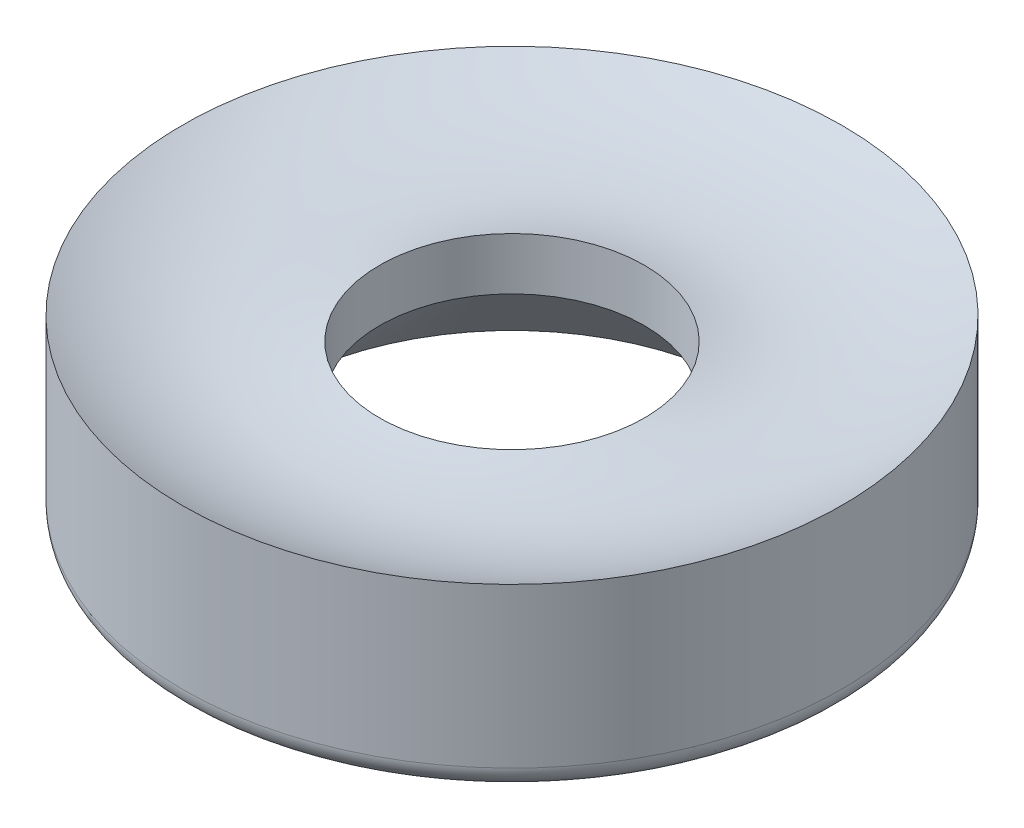
ISO-10303-21;
HEADER;
FILE_DESCRIPTION(('STEP AP214'),'2;1');
FILE_NAME('part.step','',(''),(''),'','','');
FILE_SCHEMA(('AUTOMOTIVE_DESIGN { 1 0 10303 214 1 1 1 1 }'));
ENDSEC;
DATA;
#1=APPLICATION_CONTEXT('core data for automotive mechanical design processes');
#2=APPLICATION_PROTOCOL_DEFINITION('international standard','automotive_design',2000,#1);
#3=PRODUCT_CONTEXT('',#1,'mechanical');
#4=PRODUCT('Part','Part','',(#3));
#5=PRODUCT_RELATED_PRODUCT_CATEGORY('part','',(#4));
#6=PRODUCT_DEFINITION_FORMATION('','',#4);
#7=PRODUCT_DEFINITION_CONTEXT('part definition',#1,'design');
#8=PRODUCT_DEFINITION('design','',#6,#7);
#9=PRODUCT_DEFINITION_SHAPE('','',#8);
#10=(LENGTH_UNIT() NAMED_UNIT(*) SI_UNIT(.MILLI.,.METRE.));
#11=(NAMED_UNIT(*) PLANE_ANGLE_UNIT() SI_UNIT($,.RADIAN.));
#12=(NAMED_UNIT(*) SI_UNIT($,.STERADIAN.) SOLID_ANGLE_UNIT());
#13=UNCERTAINTY_MEASURE_WITH_UNIT(LENGTH_MEASURE(1.E-05),#10,'distance_accuracy_value','');
#14=(GEOMETRIC_REPRESENTATION_CONTEXT(3) GLOBAL_UNCERTAINTY_ASSIGNED_CONTEXT((#13)) GLOBAL_UNIT_ASSIGNED_CONTEXT((#10,
#11,#12)) REPRESENTATION_CONTEXT('',''));
#15=CARTESIAN_POINT('',(0.,0.,0.));
#16=DIRECTION('',(0.,0.,1.));
#17=DIRECTION('',(1.,0.,0.));
#18=AXIS2_PLACEMENT_3D('',#15,#16,#17);
#19=CARTESIAN_POINT('',(0.,6.35,30.431156816));
#20=DIRECTION('',(0.,-1.,0.));
#21=DIRECTION('',(0.,0.,-1.));
#22=AXIS2_PLACEMENT_3D('',#19,#20,#21);
#23=CYLINDRICAL_SURFACE('',#22,3.175);
#24=DIRECTION('',(0.,1.,0.));
#25=VECTOR('',#24,1.);
#26=CARTESIAN_POINT('',(1.27,3.81,33.341092382297));
#27=LINE('',#26,#25);
#28=CARTESIAN_POINT('',(1.27,3.81,33.341092382297));
#29=VERTEX_POINT('',#28);
#30=CARTESIAN_POINT('',(1.27,6.35,33.341092382297));
#31=VERTEX_POINT('',#30);
#32=EDGE_CURVE('E770',#29,#31,#27,.T.);
#33=ORIENTED_EDGE('',*,*,#32,.T.);
#34=CARTESIAN_POINT('',(0.,6.35,30.431156816));
#35=DIRECTION('',(0.,-1.,0.));
#36=DIRECTION('',(0.,0.,-1.));
#37=AXIS2_PLACEMENT_3D('',#34,#35,#36);
#38=CIRCLE('',#37,3.175);
#39=CARTESIAN_POINT('',(-2.90993556629696,6.35,29.161156816));
#40=VERTEX_POINT('',#39);
#41=EDGE_CURVE('E343',#40,#31,#38,.T.);
#42=ORIENTED_EDGE('',*,*,#41,.F.);
#43=DIRECTION('',(0.,-1.,0.));
#44=VECTOR('',#43,1.);
#45=CARTESIAN_POINT('',(-2.90993556629696,9.31783133207061,29.161156816));
#46=LINE('',#45,#44);
#47=CARTESIAN_POINT('',(-2.90993556629696,0.,29.161156816));
#48=VERTEX_POINT('',#47);
#49=EDGE_CURVE('E231',#40,#48,#46,.T.);
#50=ORIENTED_EDGE('',*,*,#49,.T.);
#51=CARTESIAN_POINT('',(0.,0.,30.431156816));
#52=DIRECTION('',(0.,-1.,0.));
#53=DIRECTION('',(0.,0.,-1.));
#54=AXIS2_PLACEMENT_3D('',#51,#52,#53);
#55=CIRCLE('',#54,3.175);
#56=CARTESIAN_POINT('',(-2.90993556629696,0.,31.701156816));
#57=VERTEX_POINT('',#56);
#58=EDGE_CURVE('E328',#48,#57,#55,.T.);
#59=ORIENTED_EDGE('',*,*,#58,.T.);
#60=DIRECTION('',(0.,-1.,0.));
#61=VECTOR('',#60,1.);
#62=CARTESIAN_POINT('',(-2.90993556629696,9.31783133207061,31.701156816));
#63=LINE('',#62,#61);
#64=CARTESIAN_POINT('',(-2.90993556629696,3.81,31.701156816));
#65=VERTEX_POINT('',#64);
#66=EDGE_CURVE('E228',#65,#57,#63,.T.);
#67=ORIENTED_EDGE('',*,*,#66,.F.);
#68=CARTESIAN_POINT('',(0.,3.81,30.431156816));
#69=DIRECTION('',(0.,1.,0.));
#70=DIRECTION('',(0.,0.,1.));
#71=AXIS2_PLACEMENT_3D('',#68,#69,#70);
#72=CIRCLE('',#71,3.175);
#73=EDGE_CURVE('E208',#65,#29,#72,.T.);
#74=ORIENTED_EDGE('',*,*,#73,.T.);
#75=EDGE_LOOP('',(#33,#42,#50,#59,#67,#74));
#76=FACE_BOUND('',#75,.T.);
#77=ADVANCED_FACE('F35',(#76),#23,.F.);
#78=CARTESIAN_POINT('',(-30.431156816,6.35,0.));
#79=DIRECTION('',(0.,-1.,0.));
#80=DIRECTION('',(0.,0.,-1.));
#81=AXIS2_PLACEMENT_3D('',#78,#79,#80);
#82=CYLINDRICAL_SURFACE('',#81,3.175);
#83=DIRECTION('',(0.,1.,0.));
#84=VECTOR('',#83,1.);
#85=CARTESIAN_POINT('',(-33.341092382297,3.81,1.26999999999965));
#86=LINE('',#85,#84);
#87=CARTESIAN_POINT('',(-33.341092382297,3.81,1.26999999999965));
#88=VERTEX_POINT('',#87);
#89=CARTESIAN_POINT('',(-33.341092382297,6.35,1.26999999999965));
#90=VERTEX_POINT('',#89);
#91=EDGE_CURVE('E771',#88,#90,#86,.T.);
#92=ORIENTED_EDGE('',*,*,#91,.T.);
#93=CARTESIAN_POINT('',(-30.431156816,6.35,0.));
#94=DIRECTION('',(0.,-1.,0.));
#95=DIRECTION('',(0.,0.,-1.));
#96=AXIS2_PLACEMENT_3D('',#93,#94,#95);
#97=CIRCLE('',#96,3.175);
#98=CARTESIAN_POINT('',(-29.161156816,6.35,-2.90993556629695));
#99=VERTEX_POINT('',#98);
#100=EDGE_CURVE('E326',#99,#90,#97,.T.);
#101=ORIENTED_EDGE('',*,*,#100,.F.);
#102=DIRECTION('',(0.,-1.,0.));
#103=VECTOR('',#102,1.);
#104=CARTESIAN_POINT('',(-29.161156816,9.31783133207063,-2.90993556629727));
#105=LINE('',#104,#103);
#106=CARTESIAN_POINT('',(-29.161156816,0.,-2.90993556629727));
#107=VERTEX_POINT('',#106);
#108=EDGE_CURVE('E258',#99,#107,#105,.T.);
#109=ORIENTED_EDGE('',*,*,#108,.T.);
#110=CARTESIAN_POINT('',(-30.431156816,0.,0.));
#111=DIRECTION('',(0.,-1.,0.));
#112=DIRECTION('',(0.,0.,-1.));
#113=AXIS2_PLACEMENT_3D('',#110,#111,#112);
#114=CIRCLE('',#113,3.175);
#115=CARTESIAN_POINT('',(-31.701156816,0.,-2.90993556629729));
#116=VERTEX_POINT('',#115);
#117=EDGE_CURVE('E329',#107,#116,#114,.T.);
#118=ORIENTED_EDGE('',*,*,#117,.T.);
#119=DIRECTION('',(0.,-1.,0.));
#120=VECTOR('',#119,1.);
#121=CARTESIAN_POINT('',(-31.701156816,9.31783133207063,-2.90993556629729));
#122=LINE('',#121,#120);
#123=CARTESIAN_POINT('',(-31.701156816,3.81,-2.90993556629729));
#124=VERTEX_POINT('',#123);
#125=EDGE_CURVE('E256',#124,#116,#122,.T.);
#126=ORIENTED_EDGE('',*,*,#125,.F.);
#127=CARTESIAN_POINT('',(-30.431156816,3.81,-3.18749448427419E-13));
#128=DIRECTION('',(0.,1.,0.));
#129=DIRECTION('',(-1.,0.,0.));
#130=AXIS2_PLACEMENT_3D('',#127,#128,#129);
#131=CIRCLE('',#130,3.175);
#132=EDGE_CURVE('E789',#124,#88,#131,.T.);
#133=ORIENTED_EDGE('',*,*,#132,.T.);
#134=EDGE_LOOP('',(#92,#101,#109,#118,#126,#133));
#135=FACE_BOUND('',#134,.T.);
#136=ADVANCED_FACE('F424',(#135),#82,.F.);
#137=CARTESIAN_POINT('',(30.431156816,6.35,0.));
#138=DIRECTION('',(0.,-1.,0.));
#139=DIRECTION('',(0.,0.,-1.));
#140=AXIS2_PLACEMENT_3D('',#137,#138,#139);
#141=CYLINDRICAL_SURFACE('',#140,3.175);
#142=DIRECTION('',(0.,1.,0.));
#143=VECTOR('',#142,1.);
#144=CARTESIAN_POINT('',(33.341092382297,3.81,-1.26999999999988));
#145=LINE('',#144,#143);
#146=CARTESIAN_POINT('',(33.341092382297,3.81,-1.26999999999988));
#147=VERTEX_POINT('',#146);
#148=CARTESIAN_POINT('',(33.341092382297,6.35,-1.26999999999988));
#149=VERTEX_POINT('',#148);
#150=EDGE_CURVE('E249',#147,#149,#145,.T.);
#151=ORIENTED_EDGE('',*,*,#150,.T.);
#152=CARTESIAN_POINT('',(30.431156816,6.35,0.));
#153=DIRECTION('',(0.,-1.,0.));
#154=DIRECTION('',(0.,0.,-1.));
#155=AXIS2_PLACEMENT_3D('',#152,#153,#154);
#156=CIRCLE('',#155,3.175);
#157=CARTESIAN_POINT('',(29.161156816,6.35,2.90993556629696));
#158=VERTEX_POINT('',#157);
#159=EDGE_CURVE('E338',#158,#149,#156,.T.);
#160=ORIENTED_EDGE('',*,*,#159,.F.);
#161=DIRECTION('',(0.,-1.,0.));
#162=VECTOR('',#161,1.);
#163=CARTESIAN_POINT('',(29.161156816,9.31783133207062,2.90993556629706));
#164=LINE('',#163,#162);
#165=CARTESIAN_POINT('',(29.161156816,0.,2.90993556629706));
#166=VERTEX_POINT('',#165);
#167=EDGE_CURVE('E279',#158,#166,#164,.T.);
#168=ORIENTED_EDGE('',*,*,#167,.T.);
#169=CARTESIAN_POINT('',(30.431156816,0.,0.));
#170=DIRECTION('',(0.,-1.,0.));
#171=DIRECTION('',(0.,0.,-1.));
#172=AXIS2_PLACEMENT_3D('',#169,#170,#171);
#173=CIRCLE('',#172,3.175);
#174=CARTESIAN_POINT('',(31.701156816,0.,2.90993556629707));
#175=VERTEX_POINT('',#174);
#176=EDGE_CURVE('E325',#166,#175,#173,.T.);
#177=ORIENTED_EDGE('',*,*,#176,.T.);
#178=DIRECTION('',(0.,-1.,0.));
#179=VECTOR('',#178,1.);
#180=CARTESIAN_POINT('',(31.701156816,9.31783133207062,2.90993556629707));
#181=LINE('',#180,#179);
#182=CARTESIAN_POINT('',(31.701156816,3.81,2.90993556629707));
#183=VERTEX_POINT('',#182);
#184=EDGE_CURVE('E277',#183,#175,#181,.T.);
#185=ORIENTED_EDGE('',*,*,#184,.F.);
#186=CARTESIAN_POINT('',(30.431156816,3.81,1.06249816142473E-13));
#187=DIRECTION('',(0.,1.,0.));
#188=DIRECTION('',(1.,0.,0.));
#189=AXIS2_PLACEMENT_3D('',#186,#187,#188);
#190=CIRCLE('',#189,3.175);
#191=EDGE_CURVE('E806',#183,#147,#190,.T.);
#192=ORIENTED_EDGE('',*,*,#191,.T.);
#193=EDGE_LOOP('',(#151,#160,#168,#177,#185,#192));
#194=FACE_BOUND('',#193,.T.);
#195=ADVANCED_FACE('F430',(#194),#141,.F.);
#196=CARTESIAN_POINT('',(0.,6.35,-30.431156816));
#197=DIRECTION('',(0.,-1.,0.));
#198=DIRECTION('',(0.,0.,-1.));
#199=AXIS2_PLACEMENT_3D('',#196,#197,#198);
#200=CYLINDRICAL_SURFACE('',#199,3.175);
#201=DIRECTION('',(0.,1.,0.));
#202=VECTOR('',#201,1.);
#203=CARTESIAN_POINT('',(-1.27,3.81,-33.341092382297));
#204=LINE('',#203,#202);
#205=CARTESIAN_POINT('',(-1.27,3.81,-33.341092382297));
#206=VERTEX_POINT('',#205);
#207=CARTESIAN_POINT('',(-1.27,6.35,-33.341092382297));
#208=VERTEX_POINT('',#207);
#209=EDGE_CURVE('E301',#206,#208,#204,.T.);
#210=ORIENTED_EDGE('',*,*,#209,.T.);
#211=CARTESIAN_POINT('',(0.,6.35,-30.431156816));
#212=DIRECTION('',(0.,-1.,0.));
#213=DIRECTION('',(0.,0.,-1.));
#214=AXIS2_PLACEMENT_3D('',#211,#212,#213);
#215=CIRCLE('',#214,3.175);
#216=CARTESIAN_POINT('',(2.90993556629696,6.35,-29.161156816));
#217=VERTEX_POINT('',#216);
#218=EDGE_CURVE('E332',#217,#208,#215,.T.);
#219=ORIENTED_EDGE('',*,*,#218,.F.);
#220=DIRECTION('',(0.,-1.,0.));
#221=VECTOR('',#220,1.);
#222=CARTESIAN_POINT('',(2.90993556629696,9.31783133207061,-29.161156816));
#223=LINE('',#222,#221);
#224=CARTESIAN_POINT('',(2.90993556629696,0.,-29.161156816));
#225=VERTEX_POINT('',#224);
#226=EDGE_CURVE('E320',#217,#225,#223,.T.);
#227=ORIENTED_EDGE('',*,*,#226,.T.);
#228=CARTESIAN_POINT('',(0.,0.,-30.431156816));
#229=DIRECTION('',(0.,-1.,0.));
#230=DIRECTION('',(0.,0.,-1.));
#231=AXIS2_PLACEMENT_3D('',#228,#229,#230);
#232=CIRCLE('',#231,3.175);
#233=CARTESIAN_POINT('',(2.90993556629696,0.,-31.701156816));
#234=VERTEX_POINT('',#233);
#235=EDGE_CURVE('E335',#225,#234,#232,.T.);
#236=ORIENTED_EDGE('',*,*,#235,.T.);
#237=DIRECTION('',(0.,-1.,0.));
#238=VECTOR('',#237,1.);
#239=CARTESIAN_POINT('',(2.90993556629696,9.31783133207061,-31.701156816));
#240=LINE('',#239,#238);
#241=CARTESIAN_POINT('',(2.90993556629696,3.81,-31.701156816));
#242=VERTEX_POINT('',#241);
#243=EDGE_CURVE('E318',#242,#234,#240,.T.);
#244=ORIENTED_EDGE('',*,*,#243,.F.);
#245=CARTESIAN_POINT('',(0.,3.81,-30.431156816));
#246=DIRECTION('',(0.,1.,0.));
#247=DIRECTION('',(0.,0.,-1.));
#248=AXIS2_PLACEMENT_3D('',#245,#246,#247);
#249=CIRCLE('',#248,3.175);
#250=EDGE_CURVE('E291',#242,#206,#249,.T.);
#251=ORIENTED_EDGE('',*,*,#250,.T.);
#252=EDGE_LOOP('',(#210,#219,#227,#236,#244,#251));
#253=FACE_BOUND('',#252,.T.);
#254=ADVANCED_FACE('F409',(#253),#200,.F.);
#255=CARTESIAN_POINT('',(0.,88.138,0.));
#256=DIRECTION('',(0.,-1.,0.));
#257=DIRECTION('',(0.,0.,-1.));
#258=AXIS2_PLACEMENT_3D('',#255,#256,#257);
#259=CYLINDRICAL_SURFACE('',#258,14.7955);
#260=CARTESIAN_POINT('',(0.,11.9380000000001,0.));
#261=DIRECTION('',(0.,-1.,0.));
#262=DIRECTION('',(0.,0.,-1.));
#263=AXIS2_PLACEMENT_3D('',#260,#261,#262);
#264=CIRCLE('',#263,14.7955);
#265=CARTESIAN_POINT('',(0.,11.938,-14.7955));
#266=VERTEX_POINT('',#265);
#267=EDGE_CURVE('E353',#266,#266,#264,.T.);
#268=ORIENTED_EDGE('',*,*,#267,.T.);
#269=EDGE_LOOP('',(#268));
#270=FACE_BOUND('',#269,.T.);
#271=CARTESIAN_POINT('',(0.,17.78,0.));
#272=DIRECTION('',(0.,-1.,0.));
#273=DIRECTION('',(0.,0.,-1.));
#274=AXIS2_PLACEMENT_3D('',#271,#272,#273);
#275=CIRCLE('',#274,14.7955);
#276=CARTESIAN_POINT('',(0.,17.78,-14.7955));
#277=VERTEX_POINT('',#276);
#278=EDGE_CURVE('E350',#277,#277,#275,.T.);
#279=ORIENTED_EDGE('',*,*,#278,.F.);
#280=EDGE_LOOP('',(#279));
#281=FACE_BOUND('',#280,.T.);
#282=ADVANCED_FACE('F375',(#270,#281),#259,.F.);
#283=CARTESIAN_POINT('',(0.,20.32,0.));
#284=DIRECTION('',(0.,-1.,0.));
#285=DIRECTION('',(0.,0.,-1.));
#286=AXIS2_PLACEMENT_3D('',#283,#284,#285);
#287=CYLINDRICAL_SURFACE('',#286,36.83);
#288=CARTESIAN_POINT('',(0.,2.54,0.));
#289=DIRECTION('',(0.,1.,0.));
#290=DIRECTION('',(0.,0.,1.));
#291=AXIS2_PLACEMENT_3D('',#288,#289,#290);
#292=CIRCLE('',#291,36.83);
#293=CARTESIAN_POINT('',(0.,2.54,36.83));
#294=VERTEX_POINT('',#293);
#295=EDGE_CURVE('E46',#294,#294,#292,.T.);
#296=ORIENTED_EDGE('',*,*,#295,.T.);
#297=EDGE_LOOP('',(#296));
#298=FACE_BOUND('',#297,.T.);
#299=CARTESIAN_POINT('',(0.,20.32,0.));
#300=DIRECTION('',(0.,-1.,0.));
#301=DIRECTION('',(0.,0.,-1.));
#302=AXIS2_PLACEMENT_3D('',#299,#300,#301);
#303=CIRCLE('',#302,36.83);
#304=CARTESIAN_POINT('',(0.,20.32,-36.83));
#305=VERTEX_POINT('',#304);
#306=EDGE_CURVE('E345',#305,#305,#303,.T.);
#307=ORIENTED_EDGE('',*,*,#306,.T.);
#308=EDGE_LOOP('',(#307));
#309=FACE_BOUND('',#308,.T.);
#310=ADVANCED_FACE('F408',(#298,#309),#287,.T.);
#311=CARTESIAN_POINT('',(0.,0.,0.));
#312=DIRECTION('',(0.,1.,0.));
#313=DIRECTION('',(0.,0.,1.));
#314=AXIS2_PLACEMENT_3D('',#311,#312,#313);
#315=PLANE('',#314);
#316=CARTESIAN_POINT('',(-30.431156816,0.,-3.18749448427419E-13));
#317=DIRECTION('',(0.,-1.,0.));
#318=DIRECTION('',(-1.,0.,0.));
#319=AXIS2_PLACEMENT_3D('',#316,#317,#318);
#320=CIRCLE('',#319,4.445);
#321=CARTESIAN_POINT('',(-31.701156816,0.,-4.25970949713743));
#322=VERTEX_POINT('',#321);
#323=CARTESIAN_POINT('',(-29.161156816,0.,-4.25970949713741));
#324=VERTEX_POINT('',#323);
#325=EDGE_CURVE('E245',#322,#324,#320,.T.);
#326=ORIENTED_EDGE('',*,*,#325,.F.);
#327=DIRECTION('',(0.,0.,-1.));
#328=VECTOR('',#327,1.);
#329=CARTESIAN_POINT('',(-31.701156816,0.,-4.25970949713743));
#330=LINE('',#329,#328);
#331=EDGE_CURVE('E251',#116,#322,#330,.T.);
#332=ORIENTED_EDGE('',*,*,#331,.F.);
#333=ORIENTED_EDGE('',*,*,#117,.F.);
#334=DIRECTION('',(0.,0.,1.));
#335=VECTOR('',#334,1.);
#336=CARTESIAN_POINT('',(-29.161156816,0.,-4.25970949713741));
#337=LINE('',#336,#335);
#338=EDGE_CURVE('E248',#324,#107,#337,.T.);
#339=ORIENTED_EDGE('',*,*,#338,.F.);
#340=EDGE_LOOP('',(#326,#332,#333,#339));
#341=FACE_BOUND('',#340,.T.);
#342=CARTESIAN_POINT('',(0.,0.,-30.431156816));
#343=DIRECTION('',(0.,-1.,0.));
#344=DIRECTION('',(0.,0.,-1.));
#345=AXIS2_PLACEMENT_3D('',#342,#343,#344);
#346=CIRCLE('',#345,4.445);
#347=CARTESIAN_POINT('',(4.2597094971371,0.,-31.701156816));
#348=VERTEX_POINT('',#347);
#349=CARTESIAN_POINT('',(4.2597094971371,0.,-29.161156816));
#350=VERTEX_POINT('',#349);
#351=EDGE_CURVE('E304',#348,#350,#346,.T.);
#352=ORIENTED_EDGE('',*,*,#351,.F.);
#353=DIRECTION('',(1.,0.,0.));
#354=VECTOR('',#353,1.);
#355=CARTESIAN_POINT('',(4.2597094971371,0.,-31.701156816));
#356=LINE('',#355,#354);
#357=EDGE_CURVE('E313',#234,#348,#356,.T.);
#358=ORIENTED_EDGE('',*,*,#357,.F.);
#359=ORIENTED_EDGE('',*,*,#235,.F.);
#360=DIRECTION('',(-1.,0.,0.));
#361=VECTOR('',#360,1.);
#362=CARTESIAN_POINT('',(4.2597094971371,0.,-29.161156816));
#363=LINE('',#362,#361);
#364=EDGE_CURVE('E311',#350,#225,#363,.T.);
#365=ORIENTED_EDGE('',*,*,#364,.F.);
#366=EDGE_LOOP('',(#352,#358,#359,#365));
#367=FACE_BOUND('',#366,.T.);
#368=CARTESIAN_POINT('',(30.431156816,0.,1.06249816142473E-13));
#369=DIRECTION('',(0.,-1.,0.));
#370=DIRECTION('',(1.,0.,0.));
#371=AXIS2_PLACEMENT_3D('',#368,#369,#370);
#372=CIRCLE('',#371,4.445);
#373=CARTESIAN_POINT('',(31.701156816,0.,4.25970949713721));
#374=VERTEX_POINT('',#373);
#375=CARTESIAN_POINT('',(29.161156816,0.,4.2597094971372));
#376=VERTEX_POINT('',#375);
#377=EDGE_CURVE('E241',#374,#376,#372,.T.);
#378=ORIENTED_EDGE('',*,*,#377,.F.);
#379=DIRECTION('',(0.,0.,1.));
#380=VECTOR('',#379,1.);
#381=CARTESIAN_POINT('',(31.701156816,0.,4.25970949713721));
#382=LINE('',#381,#380);
#383=EDGE_CURVE('E272',#175,#374,#382,.T.);
#384=ORIENTED_EDGE('',*,*,#383,.F.);
#385=ORIENTED_EDGE('',*,*,#176,.F.);
#386=DIRECTION('',(0.,0.,-1.));
#387=VECTOR('',#386,1.);
#388=CARTESIAN_POINT('',(29.161156816,0.,4.2597094971372));
#389=LINE('',#388,#387);
#390=EDGE_CURVE('E270',#376,#166,#389,.T.);
#391=ORIENTED_EDGE('',*,*,#390,.F.);
#392=EDGE_LOOP('',(#378,#384,#385,#391));
#393=FACE_BOUND('',#392,.T.);
#394=CARTESIAN_POINT('',(0.,0.,30.431156816));
#395=DIRECTION('',(0.,-1.,0.));
#396=DIRECTION('',(0.,0.,1.));
#397=AXIS2_PLACEMENT_3D('',#394,#395,#396);
#398=CIRCLE('',#397,4.445);
#399=CARTESIAN_POINT('',(-4.2597094971371,0.,31.701156816));
#400=VERTEX_POINT('',#399);
#401=CARTESIAN_POINT('',(-4.2597094971371,0.,29.161156816));
#402=VERTEX_POINT('',#401);
#403=EDGE_CURVE('E263',#400,#402,#398,.T.);
#404=ORIENTED_EDGE('',*,*,#403,.F.);
#405=DIRECTION('',(-1.,0.,0.));
#406=VECTOR('',#405,1.);
#407=CARTESIAN_POINT('',(-4.2597094971371,0.,31.701156816));
#408=LINE('',#407,#406);
#409=EDGE_CURVE('E225',#57,#400,#408,.T.);
#410=ORIENTED_EDGE('',*,*,#409,.F.);
#411=ORIENTED_EDGE('',*,*,#58,.F.);
#412=DIRECTION('',(1.,0.,0.));
#413=VECTOR('',#412,1.);
#414=CARTESIAN_POINT('',(-4.2597094971371,0.,29.161156816));
#415=LINE('',#414,#413);
#416=EDGE_CURVE('E816',#402,#48,#415,.T.);
#417=ORIENTED_EDGE('',*,*,#416,.F.);
#418=EDGE_LOOP('',(#404,#410,#411,#417));
#419=FACE_BOUND('',#418,.T.);
#420=CARTESIAN_POINT('',(0.,0.,0.));
#421=DIRECTION('',(0.,1.,0.));
#422=DIRECTION('',(0.,0.,1.));
#423=AXIS2_PLACEMENT_3D('',#420,#421,#422);
#424=CIRCLE('',#423,26.67);
#425=CARTESIAN_POINT('',(0.,0.,26.67));
#426=VERTEX_POINT('',#425);
#427=EDGE_CURVE('E358',#426,#426,#424,.T.);
#428=ORIENTED_EDGE('',*,*,#427,.T.);
#429=EDGE_LOOP('',(#428));
#430=FACE_BOUND('',#429,.T.);
#431=CARTESIAN_POINT('',(0.,0.,0.));
#432=DIRECTION('',(0.,1.,0.));
#433=DIRECTION('',(0.,0.,1.));
#434=AXIS2_PLACEMENT_3D('',#431,#432,#433);
#435=CIRCLE('',#434,34.29);
#436=CARTESIAN_POINT('',(0.,0.,34.29));
#437=VERTEX_POINT('',#436);
#438=EDGE_CURVE('E12',#437,#437,#435,.F.);
#439=ORIENTED_EDGE('',*,*,#438,.T.);
#440=EDGE_LOOP('',(#439));
#441=FACE_BOUND('',#440,.T.);
#442=ADVANCED_FACE('F378',(#341,#367,#393,#419,#430,#441),#315,.F.);
#443=CARTESIAN_POINT('',(0.,2.54,0.));
#444=DIRECTION('',(0.,1.,0.));
#445=DIRECTION('',(0.,0.,1.));
#446=AXIS2_PLACEMENT_3D('',#443,#444,#445);
#447=TOROIDAL_SURFACE('',#446,34.29,2.54);
#448=ORIENTED_EDGE('',*,*,#438,.F.);
#449=EDGE_LOOP('',(#448));
#450=FACE_BOUND('',#449,.T.);
#451=ORIENTED_EDGE('',*,*,#295,.F.);
#452=EDGE_LOOP('',(#451));
#453=FACE_BOUND('',#452,.T.);
#454=ADVANCED_FACE('F37',(#450,#453),#447,.T.);
#455=CARTESIAN_POINT('',(0.,11.938,0.));
#456=DIRECTION('',(0.,-1.,0.));
#457=DIRECTION('',(0.,0.,-1.));
#458=AXIS2_PLACEMENT_3D('',#455,#456,#457);
#459=CONICAL_SURFACE('',#458,14.7955,0.782731503051742);
#460=ORIENTED_EDGE('',*,*,#427,.F.);
#461=EDGE_LOOP('',(#460));
#462=FACE_BOUND('',#461,.T.);
#463=ORIENTED_EDGE('',*,*,#267,.F.);
#464=EDGE_LOOP('',(#463));
#465=FACE_BOUND('',#464,.T.);
#466=ADVANCED_FACE('F365',(#462,#465),#459,.F.);
#467=CARTESIAN_POINT('',(0.,48.6044105988338,0.));
#468=DIRECTION('',(0.,-1.,0.));
#469=DIRECTION('',(0.,0.,-1.));
#470=AXIS2_PLACEMENT_3D('',#467,#468,#469);
#471=DEGENERATE_TOROIDAL_SURFACE('',#470,22.4059015159846,31.75,.T.);
#472=ORIENTED_EDGE('',*,*,#278,.T.);
#473=EDGE_LOOP('',(#472));
#474=FACE_BOUND('',#473,.T.);
#475=ORIENTED_EDGE('',*,*,#306,.F.);
#476=EDGE_LOOP('',(#475));
#477=FACE_BOUND('',#476,.T.);
#478=ADVANCED_FACE('F374',(#474,#477),#471,.F.);
#479=CARTESIAN_POINT('',(0.,6.35,30.431156816));
#480=DIRECTION('',(0.,-1.,0.));
#481=DIRECTION('',(0.,0.,-1.));
#482=AXIS2_PLACEMENT_3D('',#479,#480,#481);
#483=PLANE('',#482);
#484=ORIENTED_EDGE('',*,*,#41,.T.);
#485=DIRECTION('',(0.,0.,1.));
#486=VECTOR('',#485,1.);
#487=CARTESIAN_POINT('',(1.27,6.35,34.6908663131371));
#488=LINE('',#487,#486);
#489=CARTESIAN_POINT('',(1.27,6.35,34.6908663131371));
#490=VERTEX_POINT('',#489);
#491=EDGE_CURVE('E221',#31,#490,#488,.T.);
#492=ORIENTED_EDGE('',*,*,#491,.T.);
#493=CARTESIAN_POINT('',(0.,6.35,30.431156816));
#494=DIRECTION('',(0.,-1.,0.));
#495=DIRECTION('',(0.,0.,-1.));
#496=AXIS2_PLACEMENT_3D('',#493,#494,#495);
#497=CIRCLE('',#496,4.445);
#498=CARTESIAN_POINT('',(-4.2597094971371,6.35,29.161156816));
#499=VERTEX_POINT('',#498);
#500=EDGE_CURVE('E227',#499,#490,#497,.F.);
#501=ORIENTED_EDGE('',*,*,#500,.F.);
#502=DIRECTION('',(-1.,0.,0.));
#503=VECTOR('',#502,1.);
#504=CARTESIAN_POINT('',(-4.2597094971371,6.35,29.161156816));
#505=LINE('',#504,#503);
#506=EDGE_CURVE('E54',#40,#499,#505,.T.);
#507=ORIENTED_EDGE('',*,*,#506,.F.);
#508=EDGE_LOOP('',(#484,#492,#501,#507));
#509=FACE_BOUND('',#508,.T.);
#510=ADVANCED_FACE('F414',(#509),#483,.T.);
#511=CARTESIAN_POINT('',(30.431156816,6.35,0.));
#512=DIRECTION('',(0.,-1.,0.));
#513=DIRECTION('',(0.,0.,-1.));
#514=AXIS2_PLACEMENT_3D('',#511,#512,#513);
#515=PLANE('',#514);
#516=ORIENTED_EDGE('',*,*,#159,.T.);
#517=DIRECTION('',(1.,0.,0.));
#518=VECTOR('',#517,1.);
#519=CARTESIAN_POINT('',(34.6908663131371,6.35,-1.26999999999988));
#520=LINE('',#519,#518);
#521=CARTESIAN_POINT('',(34.6908663131371,6.35,-1.26999999999988));
#522=VERTEX_POINT('',#521);
#523=EDGE_CURVE('E774',#149,#522,#520,.T.);
#524=ORIENTED_EDGE('',*,*,#523,.T.);
#525=CARTESIAN_POINT('',(30.431156816,6.35,1.06249816142473E-13));
#526=DIRECTION('',(0.,-1.,0.));
#527=DIRECTION('',(0.,0.,-1.));
#528=AXIS2_PLACEMENT_3D('',#525,#526,#527);
#529=CIRCLE('',#528,4.445);
#530=CARTESIAN_POINT('',(29.161156816,6.35,4.2597094971372));
#531=VERTEX_POINT('',#530);
#532=EDGE_CURVE('E264',#531,#522,#529,.F.);
#533=ORIENTED_EDGE('',*,*,#532,.F.);
#534=DIRECTION('',(0.,0.,1.));
#535=VECTOR('',#534,1.);
#536=CARTESIAN_POINT('',(29.161156816,6.35,4.2597094971372));
#537=LINE('',#536,#535);
#538=EDGE_CURVE('E266',#158,#531,#537,.T.);
#539=ORIENTED_EDGE('',*,*,#538,.F.);
#540=EDGE_LOOP('',(#516,#524,#533,#539));
#541=FACE_BOUND('',#540,.T.);
#542=ADVANCED_FACE('F437',(#541),#515,.T.);
#543=CARTESIAN_POINT('',(0.,6.35,-30.431156816));
#544=DIRECTION('',(0.,-1.,0.));
#545=DIRECTION('',(0.,0.,-1.));
#546=AXIS2_PLACEMENT_3D('',#543,#544,#545);
#547=PLANE('',#546);
#548=ORIENTED_EDGE('',*,*,#218,.T.);
#549=DIRECTION('',(0.,0.,-1.));
#550=VECTOR('',#549,1.);
#551=CARTESIAN_POINT('',(-1.27,6.35,-34.6908663131371));
#552=LINE('',#551,#550);
#553=CARTESIAN_POINT('',(-1.27,6.35,-34.6908663131371));
#554=VERTEX_POINT('',#553);
#555=EDGE_CURVE('E284',#208,#554,#552,.T.);
#556=ORIENTED_EDGE('',*,*,#555,.T.);
#557=CARTESIAN_POINT('',(0.,6.35,-30.431156816));
#558=DIRECTION('',(0.,-1.,0.));
#559=DIRECTION('',(0.,0.,-1.));
#560=AXIS2_PLACEMENT_3D('',#557,#558,#559);
#561=CIRCLE('',#560,4.445);
#562=CARTESIAN_POINT('',(4.2597094971371,6.35,-29.161156816));
#563=VERTEX_POINT('',#562);
#564=EDGE_CURVE('E305',#563,#554,#561,.F.);
#565=ORIENTED_EDGE('',*,*,#564,.F.);
#566=DIRECTION('',(1.,0.,0.));
#567=VECTOR('',#566,1.);
#568=CARTESIAN_POINT('',(4.2597094971371,6.35,-29.161156816));
#569=LINE('',#568,#567);
#570=EDGE_CURVE('E307',#217,#563,#569,.T.);
#571=ORIENTED_EDGE('',*,*,#570,.F.);
#572=EDGE_LOOP('',(#548,#556,#565,#571));
#573=FACE_BOUND('',#572,.T.);
#574=ADVANCED_FACE('F443',(#573),#547,.T.);
#575=CARTESIAN_POINT('',(-30.431156816,6.35,0.));
#576=DIRECTION('',(0.,-1.,0.));
#577=DIRECTION('',(0.,0.,-1.));
#578=AXIS2_PLACEMENT_3D('',#575,#576,#577);
#579=PLANE('',#578);
#580=ORIENTED_EDGE('',*,*,#100,.T.);
#581=DIRECTION('',(-1.,0.,0.));
#582=VECTOR('',#581,1.);
#583=CARTESIAN_POINT('',(-34.6908663131371,6.35,1.26999999999964));
#584=LINE('',#583,#582);
#585=CARTESIAN_POINT('',(-34.6908663131371,6.35,1.26999999999964));
#586=VERTEX_POINT('',#585);
#587=EDGE_CURVE('E786',#90,#586,#584,.T.);
#588=ORIENTED_EDGE('',*,*,#587,.T.);
#589=CARTESIAN_POINT('',(-30.431156816,6.35,-3.18749448427419E-13));
#590=DIRECTION('',(0.,-1.,0.));
#591=DIRECTION('',(0.,0.,-1.));
#592=AXIS2_PLACEMENT_3D('',#589,#590,#591);
#593=CIRCLE('',#592,4.445);
#594=CARTESIAN_POINT('',(-29.161156816,6.35,-4.25970949713741));
#595=VERTEX_POINT('',#594);
#596=EDGE_CURVE('E242',#595,#586,#593,.F.);
#597=ORIENTED_EDGE('',*,*,#596,.F.);
#598=DIRECTION('',(0.,0.,-1.));
#599=VECTOR('',#598,1.);
#600=CARTESIAN_POINT('',(-29.161156816,6.35,-4.25970949713741));
#601=LINE('',#600,#599);
#602=EDGE_CURVE('E62',#99,#595,#601,.T.);
#603=ORIENTED_EDGE('',*,*,#602,.F.);
#604=EDGE_LOOP('',(#580,#588,#597,#603));
#605=FACE_BOUND('',#604,.T.);
#606=ADVANCED_FACE('F449',(#605),#579,.T.);
#607=CARTESIAN_POINT('',(0.,9.31783133207061,-30.431156816));
#608=DIRECTION('',(0.,-1.,0.));
#609=DIRECTION('',(0.,0.,-1.));
#610=AXIS2_PLACEMENT_3D('',#607,#608,#609);
#611=CYLINDRICAL_SURFACE('',#610,4.445);
#612=ORIENTED_EDGE('',*,*,#564,.T.);
#613=DIRECTION('',(0.,1.,0.));
#614=VECTOR('',#613,1.);
#615=CARTESIAN_POINT('',(-1.27,3.81,-34.6908663131371));
#616=LINE('',#615,#614);
#617=CARTESIAN_POINT('',(-1.27,3.81,-34.6908663131371));
#618=VERTEX_POINT('',#617);
#619=EDGE_CURVE('E296',#618,#554,#616,.T.);
#620=ORIENTED_EDGE('',*,*,#619,.F.);
#621=CARTESIAN_POINT('',(0.,3.81,-30.431156816));
#622=DIRECTION('',(0.,-1.,0.));
#623=DIRECTION('',(0.,0.,-1.));
#624=AXIS2_PLACEMENT_3D('',#621,#622,#623);
#625=CIRCLE('',#624,4.445);
#626=CARTESIAN_POINT('',(4.2597094971371,3.81,-31.701156816));
#627=VERTEX_POINT('',#626);
#628=EDGE_CURVE('E285',#618,#627,#625,.T.);
#629=ORIENTED_EDGE('',*,*,#628,.T.);
#630=DIRECTION('',(0.,-1.,0.));
#631=VECTOR('',#630,1.);
#632=CARTESIAN_POINT('',(4.2597094971371,9.31783133207061,-31.701156816));
#633=LINE('',#632,#631);
#634=EDGE_CURVE('E308',#627,#348,#633,.T.);
#635=ORIENTED_EDGE('',*,*,#634,.T.);
#636=ORIENTED_EDGE('',*,*,#351,.T.);
#637=DIRECTION('',(0.,-1.,0.));
#638=VECTOR('',#637,1.);
#639=CARTESIAN_POINT('',(4.2597094971371,9.31783133207061,-29.161156816));
#640=LINE('',#639,#638);
#641=EDGE_CURVE('E316',#563,#350,#640,.T.);
#642=ORIENTED_EDGE('',*,*,#641,.F.);
#643=EDGE_LOOP('',(#612,#620,#629,#635,#636,#642));
#644=FACE_BOUND('',#643,.T.);
#645=ADVANCED_FACE('F454',(#644),#611,.F.);
#646=CARTESIAN_POINT('',(4.2597094971371,9.31783133207061,-31.701156816));
#647=DIRECTION('',(0.,0.,-1.));
#648=DIRECTION('',(-1.,0.,0.));
#649=AXIS2_PLACEMENT_3D('',#646,#647,#648);
#650=PLANE('',#649);
#651=ORIENTED_EDGE('',*,*,#634,.F.);
#652=DIRECTION('',(-1.,0.,0.));
#653=VECTOR('',#652,1.);
#654=CARTESIAN_POINT('',(2.90993556629696,3.81,-31.701156816));
#655=LINE('',#654,#653);
#656=EDGE_CURVE('E288',#627,#242,#655,.T.);
#657=ORIENTED_EDGE('',*,*,#656,.T.);
#658=ORIENTED_EDGE('',*,*,#243,.T.);
#659=ORIENTED_EDGE('',*,*,#357,.T.);
#660=EDGE_LOOP('',(#651,#657,#658,#659));
#661=FACE_BOUND('',#660,.T.);
#662=ADVANCED_FACE('F457',(#661),#650,.F.);
#663=CARTESIAN_POINT('',(4.2597094971371,9.31783133207061,-29.161156816));
#664=DIRECTION('',(0.,0.,1.));
#665=DIRECTION('',(1.,0.,0.));
#666=AXIS2_PLACEMENT_3D('',#663,#664,#665);
#667=PLANE('',#666);
#668=ORIENTED_EDGE('',*,*,#570,.T.);
#669=ORIENTED_EDGE('',*,*,#641,.T.);
#670=ORIENTED_EDGE('',*,*,#364,.T.);
#671=ORIENTED_EDGE('',*,*,#226,.F.);
#672=EDGE_LOOP('',(#668,#669,#670,#671));
#673=FACE_BOUND('',#672,.T.);
#674=ADVANCED_FACE('F459',(#673),#667,.F.);
#675=CARTESIAN_POINT('',(-1.27,3.81,-34.6908663131371));
#676=DIRECTION('',(1.,0.,0.));
#677=DIRECTION('',(0.,0.,-1.));
#678=AXIS2_PLACEMENT_3D('',#675,#676,#677);
#679=PLANE('',#678);
#680=ORIENTED_EDGE('',*,*,#555,.F.);
#681=ORIENTED_EDGE('',*,*,#209,.F.);
#682=DIRECTION('',(0.,0.,-1.));
#683=VECTOR('',#682,1.);
#684=CARTESIAN_POINT('',(-1.27,3.81,-34.6908663131371));
#685=LINE('',#684,#683);
#686=EDGE_CURVE('E294',#206,#618,#685,.T.);
#687=ORIENTED_EDGE('',*,*,#686,.T.);
#688=ORIENTED_EDGE('',*,*,#619,.T.);
#689=EDGE_LOOP('',(#680,#681,#687,#688));
#690=FACE_BOUND('',#689,.T.);
#691=ADVANCED_FACE('F462',(#690),#679,.T.);
#692=CARTESIAN_POINT('',(0.,3.81,-30.431156816));
#693=DIRECTION('',(0.,-1.,0.));
#694=DIRECTION('',(0.,0.,-1.));
#695=AXIS2_PLACEMENT_3D('',#692,#693,#694);
#696=PLANE('',#695);
#697=ORIENTED_EDGE('',*,*,#628,.F.);
#698=ORIENTED_EDGE('',*,*,#686,.F.);
#699=ORIENTED_EDGE('',*,*,#250,.F.);
#700=ORIENTED_EDGE('',*,*,#656,.F.);
#701=EDGE_LOOP('',(#697,#698,#699,#700));
#702=FACE_BOUND('',#701,.T.);
#703=ADVANCED_FACE('F469',(#702),#696,.F.);
#704=CARTESIAN_POINT('',(30.431156816,9.31783133207062,1.06249816142473E-13));
#705=DIRECTION('',(0.,-1.,0.));
#706=DIRECTION('',(0.,0.,-1.));
#707=AXIS2_PLACEMENT_3D('',#704,#705,#706);
#708=CYLINDRICAL_SURFACE('',#707,4.445);
#709=ORIENTED_EDGE('',*,*,#532,.T.);
#710=DIRECTION('',(0.,1.,0.));
#711=VECTOR('',#710,1.);
#712=CARTESIAN_POINT('',(34.6908663131371,3.81,-1.26999999999988));
#713=LINE('',#712,#711);
#714=CARTESIAN_POINT('',(34.6908663131371,3.81,-1.26999999999988));
#715=VERTEX_POINT('',#714);
#716=EDGE_CURVE('E810',#715,#522,#713,.T.);
#717=ORIENTED_EDGE('',*,*,#716,.F.);
#718=CARTESIAN_POINT('',(30.431156816,3.81,1.06249816142473E-13));
#719=DIRECTION('',(0.,-1.,0.));
#720=DIRECTION('',(1.,0.,0.));
#721=AXIS2_PLACEMENT_3D('',#718,#719,#720);
#722=CIRCLE('',#721,4.445);
#723=CARTESIAN_POINT('',(31.701156816,3.81,4.25970949713721));
#724=VERTEX_POINT('',#723);
#725=EDGE_CURVE('E777',#715,#724,#722,.T.);
#726=ORIENTED_EDGE('',*,*,#725,.T.);
#727=DIRECTION('',(0.,-1.,0.));
#728=VECTOR('',#727,1.);
#729=CARTESIAN_POINT('',(31.701156816,9.31783133207062,4.25970949713721));
#730=LINE('',#729,#728);
#731=EDGE_CURVE('E267',#724,#374,#730,.T.);
#732=ORIENTED_EDGE('',*,*,#731,.T.);
#733=ORIENTED_EDGE('',*,*,#377,.T.);
#734=DIRECTION('',(0.,-1.,0.));
#735=VECTOR('',#734,1.);
#736=CARTESIAN_POINT('',(29.161156816,9.31783133207062,4.2597094971372));
#737=LINE('',#736,#735);
#738=EDGE_CURVE('E275',#531,#376,#737,.T.);
#739=ORIENTED_EDGE('',*,*,#738,.F.);
#740=EDGE_LOOP('',(#709,#717,#726,#732,#733,#739));
#741=FACE_BOUND('',#740,.T.);
#742=ADVANCED_FACE('F473',(#741),#708,.F.);
#743=CARTESIAN_POINT('',(31.701156816,9.31783133207062,4.25970949713721));
#744=DIRECTION('',(1.,0.,0.));
#745=DIRECTION('',(0.,0.,-1.));
#746=AXIS2_PLACEMENT_3D('',#743,#744,#745);
#747=PLANE('',#746);
#748=ORIENTED_EDGE('',*,*,#731,.F.);
#749=DIRECTION('',(0.,0.,-1.));
#750=VECTOR('',#749,1.);
#751=CARTESIAN_POINT('',(31.701156816,3.81,2.90993556629707));
#752=LINE('',#751,#750);
#753=EDGE_CURVE('E803',#724,#183,#752,.T.);
#754=ORIENTED_EDGE('',*,*,#753,.T.);
#755=ORIENTED_EDGE('',*,*,#184,.T.);
#756=ORIENTED_EDGE('',*,*,#383,.T.);
#757=EDGE_LOOP('',(#748,#754,#755,#756));
#758=FACE_BOUND('',#757,.T.);
#759=ADVANCED_FACE('F477',(#758),#747,.F.);
#760=CARTESIAN_POINT('',(29.161156816,9.31783133207062,4.2597094971372));
#761=DIRECTION('',(-1.,0.,0.));
#762=DIRECTION('',(0.,0.,1.));
#763=AXIS2_PLACEMENT_3D('',#760,#761,#762);
#764=PLANE('',#763);
#765=ORIENTED_EDGE('',*,*,#538,.T.);
#766=ORIENTED_EDGE('',*,*,#738,.T.);
#767=ORIENTED_EDGE('',*,*,#390,.T.);
#768=ORIENTED_EDGE('',*,*,#167,.F.);
#769=EDGE_LOOP('',(#765,#766,#767,#768));
#770=FACE_BOUND('',#769,.T.);
#771=ADVANCED_FACE('F479',(#770),#764,.F.);
#772=CARTESIAN_POINT('',(-30.431156816,9.31783133207063,-3.18749448427419E-13));
#773=DIRECTION('',(0.,-1.,0.));
#774=DIRECTION('',(0.,0.,-1.));
#775=AXIS2_PLACEMENT_3D('',#772,#773,#774);
#776=CYLINDRICAL_SURFACE('',#775,4.445);
#777=ORIENTED_EDGE('',*,*,#596,.T.);
#778=DIRECTION('',(0.,1.,0.));
#779=VECTOR('',#778,1.);
#780=CARTESIAN_POINT('',(-34.6908663131371,3.81,1.26999999999964));
#781=LINE('',#780,#779);
#782=CARTESIAN_POINT('',(-34.6908663131371,3.81,1.26999999999964));
#783=VERTEX_POINT('',#782);
#784=EDGE_CURVE('E794',#783,#586,#781,.T.);
#785=ORIENTED_EDGE('',*,*,#784,.F.);
#786=CARTESIAN_POINT('',(-30.431156816,3.81,-3.18749448427419E-13));
#787=DIRECTION('',(0.,-1.,0.));
#788=DIRECTION('',(-1.,0.,0.));
#789=AXIS2_PLACEMENT_3D('',#786,#787,#788);
#790=CIRCLE('',#789,4.445);
#791=CARTESIAN_POINT('',(-31.701156816,3.81,-4.25970949713743));
#792=VERTEX_POINT('',#791);
#793=EDGE_CURVE('E782',#783,#792,#790,.T.);
#794=ORIENTED_EDGE('',*,*,#793,.T.);
#795=DIRECTION('',(0.,-1.,0.));
#796=VECTOR('',#795,1.);
#797=CARTESIAN_POINT('',(-31.701156816,9.31783133207063,-4.25970949713743));
#798=LINE('',#797,#796);
#799=EDGE_CURVE('E244',#792,#322,#798,.T.);
#800=ORIENTED_EDGE('',*,*,#799,.T.);
#801=ORIENTED_EDGE('',*,*,#325,.T.);
#802=DIRECTION('',(0.,-1.,0.));
#803=VECTOR('',#802,1.);
#804=CARTESIAN_POINT('',(-29.161156816,9.31783133207063,-4.25970949713741));
#805=LINE('',#804,#803);
#806=EDGE_CURVE('E254',#595,#324,#805,.T.);
#807=ORIENTED_EDGE('',*,*,#806,.F.);
#808=EDGE_LOOP('',(#777,#785,#794,#800,#801,#807));
#809=FACE_BOUND('',#808,.T.);
#810=ADVANCED_FACE('F482',(#809),#776,.F.);
#811=CARTESIAN_POINT('',(-31.701156816,9.31783133207063,-4.25970949713743));
#812=DIRECTION('',(-1.,0.,0.));
#813=DIRECTION('',(0.,0.,1.));
#814=AXIS2_PLACEMENT_3D('',#811,#812,#813);
#815=PLANE('',#814);
#816=ORIENTED_EDGE('',*,*,#799,.F.);
#817=DIRECTION('',(0.,0.,1.));
#818=VECTOR('',#817,1.);
#819=CARTESIAN_POINT('',(-31.701156816,3.81,-2.90993556629729));
#820=LINE('',#819,#818);
#821=EDGE_CURVE('E785',#792,#124,#820,.T.);
#822=ORIENTED_EDGE('',*,*,#821,.T.);
#823=ORIENTED_EDGE('',*,*,#125,.T.);
#824=ORIENTED_EDGE('',*,*,#331,.T.);
#825=EDGE_LOOP('',(#816,#822,#823,#824));
#826=FACE_BOUND('',#825,.T.);
#827=ADVANCED_FACE('F489',(#826),#815,.F.);
#828=CARTESIAN_POINT('',(-29.161156816,9.31783133207063,-4.25970949713741));
#829=DIRECTION('',(1.,0.,0.));
#830=DIRECTION('',(0.,0.,-1.));
#831=AXIS2_PLACEMENT_3D('',#828,#829,#830);
#832=PLANE('',#831);
#833=ORIENTED_EDGE('',*,*,#602,.T.);
#834=ORIENTED_EDGE('',*,*,#806,.T.);
#835=ORIENTED_EDGE('',*,*,#338,.T.);
#836=ORIENTED_EDGE('',*,*,#108,.F.);
#837=EDGE_LOOP('',(#833,#834,#835,#836));
#838=FACE_BOUND('',#837,.T.);
#839=ADVANCED_FACE('F491',(#838),#832,.F.);
#840=CARTESIAN_POINT('',(0.,9.31783133207061,30.431156816));
#841=DIRECTION('',(0.,-1.,0.));
#842=DIRECTION('',(0.,0.,-1.));
#843=AXIS2_PLACEMENT_3D('',#840,#841,#842);
#844=CYLINDRICAL_SURFACE('',#843,4.445);
#845=ORIENTED_EDGE('',*,*,#500,.T.);
#846=DIRECTION('',(0.,1.,0.));
#847=VECTOR('',#846,1.);
#848=CARTESIAN_POINT('',(1.27,3.81,34.6908663131371));
#849=LINE('',#848,#847);
#850=CARTESIAN_POINT('',(1.27,3.81,34.6908663131371));
#851=VERTEX_POINT('',#850);
#852=EDGE_CURVE('E220',#851,#490,#849,.T.);
#853=ORIENTED_EDGE('',*,*,#852,.F.);
#854=CARTESIAN_POINT('',(0.,3.81,30.431156816));
#855=DIRECTION('',(0.,-1.,0.));
#856=DIRECTION('',(0.,0.,1.));
#857=AXIS2_PLACEMENT_3D('',#854,#855,#856);
#858=CIRCLE('',#857,4.445);
#859=CARTESIAN_POINT('',(-4.2597094971371,3.81,31.701156816));
#860=VERTEX_POINT('',#859);
#861=EDGE_CURVE('E206',#851,#860,#858,.T.);
#862=ORIENTED_EDGE('',*,*,#861,.T.);
#863=DIRECTION('',(0.,-1.,0.));
#864=VECTOR('',#863,1.);
#865=CARTESIAN_POINT('',(-4.2597094971371,9.31783133207061,31.701156816));
#866=LINE('',#865,#864);
#867=EDGE_CURVE('E217',#860,#400,#866,.T.);
#868=ORIENTED_EDGE('',*,*,#867,.T.);
#869=ORIENTED_EDGE('',*,*,#403,.T.);
#870=DIRECTION('',(0.,-1.,0.));
#871=VECTOR('',#870,1.);
#872=CARTESIAN_POINT('',(-4.2597094971371,9.31783133207061,29.161156816));
#873=LINE('',#872,#871);
#874=EDGE_CURVE('E238',#499,#402,#873,.T.);
#875=ORIENTED_EDGE('',*,*,#874,.F.);
#876=EDGE_LOOP('',(#845,#853,#862,#868,#869,#875));
#877=FACE_BOUND('',#876,.T.);
#878=ADVANCED_FACE('F215',(#877),#844,.F.);
#879=CARTESIAN_POINT('',(-4.2597094971371,9.31783133207061,31.701156816));
#880=DIRECTION('',(0.,0.,1.));
#881=DIRECTION('',(1.,0.,0.));
#882=AXIS2_PLACEMENT_3D('',#879,#880,#881);
#883=PLANE('',#882);
#884=ORIENTED_EDGE('',*,*,#867,.F.);
#885=DIRECTION('',(1.,0.,0.));
#886=VECTOR('',#885,1.);
#887=CARTESIAN_POINT('',(-2.90993556629696,3.81,31.701156816));
#888=LINE('',#887,#886);
#889=EDGE_CURVE('E202',#860,#65,#888,.T.);
#890=ORIENTED_EDGE('',*,*,#889,.T.);
#891=ORIENTED_EDGE('',*,*,#66,.T.);
#892=ORIENTED_EDGE('',*,*,#409,.T.);
#893=EDGE_LOOP('',(#884,#890,#891,#892));
#894=FACE_BOUND('',#893,.T.);
#895=ADVANCED_FACE('F223',(#894),#883,.F.);
#896=CARTESIAN_POINT('',(-4.2597094971371,9.31783133207061,29.161156816));
#897=DIRECTION('',(0.,0.,-1.));
#898=DIRECTION('',(-1.,0.,0.));
#899=AXIS2_PLACEMENT_3D('',#896,#897,#898);
#900=PLANE('',#899);
#901=ORIENTED_EDGE('',*,*,#506,.T.);
#902=ORIENTED_EDGE('',*,*,#874,.T.);
#903=ORIENTED_EDGE('',*,*,#416,.T.);
#904=ORIENTED_EDGE('',*,*,#49,.F.);
#905=EDGE_LOOP('',(#901,#902,#903,#904));
#906=FACE_BOUND('',#905,.T.);
#907=ADVANCED_FACE('F500',(#906),#900,.F.);
#908=CARTESIAN_POINT('',(34.6908663131371,3.81,-1.26999999999988));
#909=DIRECTION('',(0.,0.,1.));
#910=DIRECTION('',(1.,0.,0.));
#911=AXIS2_PLACEMENT_3D('',#908,#909,#910);
#912=PLANE('',#911);
#913=ORIENTED_EDGE('',*,*,#523,.F.);
#914=ORIENTED_EDGE('',*,*,#150,.F.);
#915=DIRECTION('',(1.,0.,0.));
#916=VECTOR('',#915,1.);
#917=CARTESIAN_POINT('',(34.6908663131371,3.81,-1.26999999999988));
#918=LINE('',#917,#916);
#919=EDGE_CURVE('E809',#147,#715,#918,.T.);
#920=ORIENTED_EDGE('',*,*,#919,.T.);
#921=ORIENTED_EDGE('',*,*,#716,.T.);
#922=EDGE_LOOP('',(#913,#914,#920,#921));
#923=FACE_BOUND('',#922,.T.);
#924=ADVANCED_FACE('F503',(#923),#912,.T.);
#925=CARTESIAN_POINT('',(30.431156816,3.81,1.06249816142473E-13));
#926=DIRECTION('',(0.,-1.,0.));
#927=DIRECTION('',(1.,0.,0.));
#928=AXIS2_PLACEMENT_3D('',#925,#926,#927);
#929=PLANE('',#928);
#930=ORIENTED_EDGE('',*,*,#725,.F.);
#931=ORIENTED_EDGE('',*,*,#919,.F.);
#932=ORIENTED_EDGE('',*,*,#191,.F.);
#933=ORIENTED_EDGE('',*,*,#753,.F.);
#934=EDGE_LOOP('',(#930,#931,#932,#933));
#935=FACE_BOUND('',#934,.T.);
#936=ADVANCED_FACE('F509',(#935),#929,.F.);
#937=CARTESIAN_POINT('',(1.27,3.81,34.6908663131371));
#938=DIRECTION('',(-1.,0.,0.));
#939=DIRECTION('',(0.,0.,1.));
#940=AXIS2_PLACEMENT_3D('',#937,#938,#939);
#941=PLANE('',#940);
#942=ORIENTED_EDGE('',*,*,#491,.F.);
#943=ORIENTED_EDGE('',*,*,#32,.F.);
#944=DIRECTION('',(0.,0.,1.));
#945=VECTOR('',#944,1.);
#946=CARTESIAN_POINT('',(1.27,3.81,34.6908663131371));
#947=LINE('',#946,#945);
#948=EDGE_CURVE('E779',#29,#851,#947,.T.);
#949=ORIENTED_EDGE('',*,*,#948,.T.);
#950=ORIENTED_EDGE('',*,*,#852,.T.);
#951=EDGE_LOOP('',(#942,#943,#949,#950));
#952=FACE_BOUND('',#951,.T.);
#953=ADVANCED_FACE('F513',(#952),#941,.T.);
#954=CARTESIAN_POINT('',(0.,3.81,30.431156816));
#955=DIRECTION('',(0.,-1.,0.));
#956=DIRECTION('',(0.,0.,1.));
#957=AXIS2_PLACEMENT_3D('',#954,#955,#956);
#958=PLANE('',#957);
#959=ORIENTED_EDGE('',*,*,#861,.F.);
#960=ORIENTED_EDGE('',*,*,#948,.F.);
#961=ORIENTED_EDGE('',*,*,#73,.F.);
#962=ORIENTED_EDGE('',*,*,#889,.F.);
#963=EDGE_LOOP('',(#959,#960,#961,#962));
#964=FACE_BOUND('',#963,.T.);
#965=ADVANCED_FACE('F204',(#964),#958,.F.);
#966=CARTESIAN_POINT('',(-34.6908663131371,3.81,1.26999999999964));
#967=DIRECTION('',(0.,0.,-1.));
#968=DIRECTION('',(-1.,0.,0.));
#969=AXIS2_PLACEMENT_3D('',#966,#967,#968);
#970=PLANE('',#969);
#971=ORIENTED_EDGE('',*,*,#587,.F.);
#972=ORIENTED_EDGE('',*,*,#91,.F.);
#973=DIRECTION('',(-1.,0.,0.));
#974=VECTOR('',#973,1.);
#975=CARTESIAN_POINT('',(-34.6908663131371,3.81,1.26999999999964));
#976=LINE('',#975,#974);
#977=EDGE_CURVE('E792',#88,#783,#976,.T.);
#978=ORIENTED_EDGE('',*,*,#977,.T.);
#979=ORIENTED_EDGE('',*,*,#784,.T.);
#980=EDGE_LOOP('',(#971,#972,#978,#979));
#981=FACE_BOUND('',#980,.T.);
#982=ADVANCED_FACE('F515',(#981),#970,.T.);
#983=CARTESIAN_POINT('',(-30.431156816,3.81,-3.18749448427419E-13));
#984=DIRECTION('',(0.,-1.,0.));
#985=DIRECTION('',(-1.,0.,0.));
#986=AXIS2_PLACEMENT_3D('',#983,#984,#985);
#987=PLANE('',#986);
#988=ORIENTED_EDGE('',*,*,#793,.F.);
#989=ORIENTED_EDGE('',*,*,#977,.F.);
#990=ORIENTED_EDGE('',*,*,#132,.F.);
#991=ORIENTED_EDGE('',*,*,#821,.F.);
#992=EDGE_LOOP('',(#988,#989,#990,#991));
#993=FACE_BOUND('',#992,.T.);
#994=ADVANCED_FACE('F518',(#993),#987,.F.);
#995=CLOSED_SHELL('',(#77,#136,#195,#254,#282,#310,#442,#454,#466,#478,#510,#542,#574,#606,#645,
#662,#674,#691,#703,#742,#759,#771,#810,#827,#839,#878,#895,#907,#924,#936,#953,#965,#982,#994));
#996=MANIFOLD_SOLID_BREP('B2',#995);
#997=ADVANCED_BREP_SHAPE_REPRESENTATION('',(#18,#996),#14);
#998=SHAPE_DEFINITION_REPRESENTATION(#9,#997);
ENDSEC;
END-ISO-10303-21;
